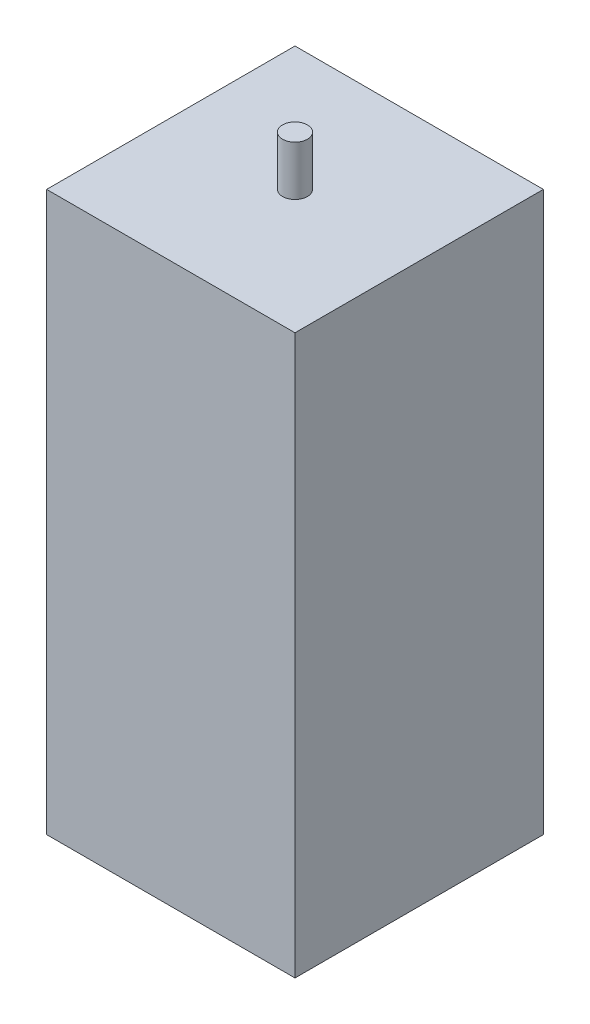
ISO-10303-21;
HEADER;
FILE_DESCRIPTION(('STEP AP214'),'2;1');
FILE_NAME('part.step','',(''),(''),'','','');
FILE_SCHEMA(('AUTOMOTIVE_DESIGN { 1 0 10303 214 1 1 1 1 }'));
ENDSEC;
DATA;
#1=APPLICATION_CONTEXT('core data for automotive mechanical design processes');
#2=APPLICATION_PROTOCOL_DEFINITION('international standard','automotive_design',2000,#1);
#3=PRODUCT_CONTEXT('',#1,'mechanical');
#4=PRODUCT('Part','Part','',(#3));
#5=PRODUCT_RELATED_PRODUCT_CATEGORY('part','',(#4));
#6=PRODUCT_DEFINITION_FORMATION('','',#4);
#7=PRODUCT_DEFINITION_CONTEXT('part definition',#1,'design');
#8=PRODUCT_DEFINITION('design','',#6,#7);
#9=PRODUCT_DEFINITION_SHAPE('','',#8);
#10=(LENGTH_UNIT() NAMED_UNIT(*) SI_UNIT(.MILLI.,.METRE.));
#11=(NAMED_UNIT(*) PLANE_ANGLE_UNIT() SI_UNIT($,.RADIAN.));
#12=(NAMED_UNIT(*) SI_UNIT($,.STERADIAN.) SOLID_ANGLE_UNIT());
#13=UNCERTAINTY_MEASURE_WITH_UNIT(LENGTH_MEASURE(1.E-05),#10,'distance_accuracy_value','');
#14=(GEOMETRIC_REPRESENTATION_CONTEXT(3) GLOBAL_UNCERTAINTY_ASSIGNED_CONTEXT((#13)) GLOBAL_UNIT_ASSIGNED_CONTEXT((#10,
#11,#12)) REPRESENTATION_CONTEXT('',''));
#15=CARTESIAN_POINT('',(0.,0.,0.));
#16=DIRECTION('',(0.,0.,1.));
#17=DIRECTION('',(1.,0.,0.));
#18=AXIS2_PLACEMENT_3D('',#15,#16,#17);
#19=CARTESIAN_POINT('',(-5.00000000000001,11.25,10.));
#20=DIRECTION('',(1.,0.,0.));
#21=DIRECTION('',(0.,1.,0.));
#22=AXIS2_PLACEMENT_3D('',#19,#20,#21);
#23=PLANE('',#22);
#24=DIRECTION('',(0.,-1.,0.));
#25=VECTOR('',#24,1.);
#26=CARTESIAN_POINT('',(-5.00000000000001,11.25,0.));
#27=LINE('',#26,#25);
#28=CARTESIAN_POINT('',(-5.00000000000001,11.25,0.));
#29=VERTEX_POINT('',#28);
#30=CARTESIAN_POINT('',(-5.,-11.25,0.));
#31=VERTEX_POINT('',#30);
#32=EDGE_CURVE('E97',#29,#31,#27,.T.);
#33=ORIENTED_EDGE('',*,*,#32,.T.);
#34=DIRECTION('',(0.,0.,-1.));
#35=VECTOR('',#34,1.);
#36=CARTESIAN_POINT('',(-5.,-11.25,10.));
#37=LINE('',#36,#35);
#38=CARTESIAN_POINT('',(-5.,-11.25,10.));
#39=VERTEX_POINT('',#38);
#40=EDGE_CURVE('E11',#39,#31,#37,.T.);
#41=ORIENTED_EDGE('',*,*,#40,.F.);
#42=DIRECTION('',(0.,-1.,0.));
#43=VECTOR('',#42,1.);
#44=CARTESIAN_POINT('',(-5.00000000000001,11.25,10.));
#45=LINE('',#44,#43);
#46=CARTESIAN_POINT('',(-5.00000000000001,11.25,10.));
#47=VERTEX_POINT('',#46);
#48=EDGE_CURVE('E84',#47,#39,#45,.T.);
#49=ORIENTED_EDGE('',*,*,#48,.F.);
#50=DIRECTION('',(0.,0.,-1.));
#51=VECTOR('',#50,1.);
#52=CARTESIAN_POINT('',(-5.00000000000001,11.25,10.));
#53=LINE('',#52,#51);
#54=EDGE_CURVE('E93',#47,#29,#53,.T.);
#55=ORIENTED_EDGE('',*,*,#54,.T.);
#56=EDGE_LOOP('',(#33,#41,#49,#55));
#57=FACE_BOUND('',#56,.T.);
#58=ADVANCED_FACE('F32',(#57),#23,.F.);
#59=CARTESIAN_POINT('',(-5.,-11.25,10.));
#60=DIRECTION('',(0.,1.,0.));
#61=DIRECTION('',(0.,0.,1.));
#62=AXIS2_PLACEMENT_3D('',#59,#60,#61);
#63=PLANE('',#62);
#64=CARTESIAN_POINT('',(0.,-11.25,5.));
#65=DIRECTION('',(0.,1.,0.));
#66=DIRECTION('',(0.,0.,1.));
#67=AXIS2_PLACEMENT_3D('',#64,#65,#66);
#68=CIRCLE('',#67,0.500000000000001);
#69=CARTESIAN_POINT('',(0.,-11.25,5.5));
#70=VERTEX_POINT('',#69);
#71=EDGE_CURVE('E100',#70,#70,#68,.T.);
#72=ORIENTED_EDGE('',*,*,#71,.T.);
#73=EDGE_LOOP('',(#72));
#74=FACE_BOUND('',#73,.T.);
#75=DIRECTION('',(1.,0.,0.));
#76=VECTOR('',#75,1.);
#77=CARTESIAN_POINT('',(-5.,-11.25,0.));
#78=LINE('',#77,#76);
#79=CARTESIAN_POINT('',(5.,-11.25,0.));
#80=VERTEX_POINT('',#79);
#81=EDGE_CURVE('E88',#31,#80,#78,.T.);
#82=ORIENTED_EDGE('',*,*,#81,.T.);
#83=DIRECTION('',(0.,0.,-1.));
#84=VECTOR('',#83,1.);
#85=CARTESIAN_POINT('',(5.,-11.25,10.));
#86=LINE('',#85,#84);
#87=CARTESIAN_POINT('',(5.,-11.25,10.));
#88=VERTEX_POINT('',#87);
#89=EDGE_CURVE('E41',#88,#80,#86,.T.);
#90=ORIENTED_EDGE('',*,*,#89,.F.);
#91=DIRECTION('',(1.,0.,0.));
#92=VECTOR('',#91,1.);
#93=CARTESIAN_POINT('',(-5.,-11.25,10.));
#94=LINE('',#93,#92);
#95=EDGE_CURVE('E79',#39,#88,#94,.T.);
#96=ORIENTED_EDGE('',*,*,#95,.F.);
#97=ORIENTED_EDGE('',*,*,#40,.T.);
#98=EDGE_LOOP('',(#82,#90,#96,#97));
#99=FACE_BOUND('',#98,.T.);
#100=ADVANCED_FACE('F87',(#74,#99),#63,.F.);
#101=CARTESIAN_POINT('',(5.00000000000002,11.25,10.));
#102=DIRECTION('',(-1.,0.,0.));
#103=DIRECTION('',(0.,-1.,0.));
#104=AXIS2_PLACEMENT_3D('',#101,#102,#103);
#105=PLANE('',#104);
#106=DIRECTION('',(0.,1.,0.));
#107=VECTOR('',#106,1.);
#108=CARTESIAN_POINT('',(5.00000000000002,11.25,0.));
#109=LINE('',#108,#107);
#110=CARTESIAN_POINT('',(5.00000000000002,11.25,0.));
#111=VERTEX_POINT('',#110);
#112=EDGE_CURVE('E66',#80,#111,#109,.T.);
#113=ORIENTED_EDGE('',*,*,#112,.T.);
#114=DIRECTION('',(0.,0.,-1.));
#115=VECTOR('',#114,1.);
#116=CARTESIAN_POINT('',(5.00000000000002,11.25,10.));
#117=LINE('',#116,#115);
#118=CARTESIAN_POINT('',(5.00000000000002,11.25,10.));
#119=VERTEX_POINT('',#118);
#120=EDGE_CURVE('E89',#119,#111,#117,.T.);
#121=ORIENTED_EDGE('',*,*,#120,.F.);
#122=DIRECTION('',(0.,1.,0.));
#123=VECTOR('',#122,1.);
#124=CARTESIAN_POINT('',(5.00000000000002,11.25,10.));
#125=LINE('',#124,#123);
#126=EDGE_CURVE('E82',#88,#119,#125,.T.);
#127=ORIENTED_EDGE('',*,*,#126,.F.);
#128=ORIENTED_EDGE('',*,*,#89,.T.);
#129=EDGE_LOOP('',(#113,#121,#127,#128));
#130=FACE_BOUND('',#129,.T.);
#131=ADVANCED_FACE('F91',(#130),#105,.F.);
#132=CARTESIAN_POINT('',(-5.00000000000001,11.25,10.));
#133=DIRECTION('',(0.,-1.,0.));
#134=DIRECTION('',(1.,0.,0.));
#135=AXIS2_PLACEMENT_3D('',#132,#133,#134);
#136=PLANE('',#135);
#137=CARTESIAN_POINT('',(0.,11.25,5.));
#138=DIRECTION('',(0.,-1.,0.));
#139=DIRECTION('',(1.,0.,0.));
#140=AXIS2_PLACEMENT_3D('',#137,#138,#139);
#141=CIRCLE('',#140,0.500000000000001);
#142=CARTESIAN_POINT('',(0.5,11.25,5.));
#143=VERTEX_POINT('',#142);
#144=EDGE_CURVE('E35',#143,#143,#141,.T.);
#145=ORIENTED_EDGE('',*,*,#144,.T.);
#146=EDGE_LOOP('',(#145));
#147=FACE_BOUND('',#146,.T.);
#148=DIRECTION('',(-1.,0.,0.));
#149=VECTOR('',#148,1.);
#150=CARTESIAN_POINT('',(-5.00000000000001,11.25,0.));
#151=LINE('',#150,#149);
#152=EDGE_CURVE('E72',#111,#29,#151,.T.);
#153=ORIENTED_EDGE('',*,*,#152,.T.);
#154=ORIENTED_EDGE('',*,*,#54,.F.);
#155=DIRECTION('',(-1.,0.,0.));
#156=VECTOR('',#155,1.);
#157=CARTESIAN_POINT('',(-5.00000000000001,11.25,10.));
#158=LINE('',#157,#156);
#159=EDGE_CURVE('E49',#119,#47,#158,.T.);
#160=ORIENTED_EDGE('',*,*,#159,.F.);
#161=ORIENTED_EDGE('',*,*,#120,.T.);
#162=EDGE_LOOP('',(#153,#154,#160,#161));
#163=FACE_BOUND('',#162,.T.);
#164=ADVANCED_FACE('F105',(#147,#163),#136,.F.);
#165=CARTESIAN_POINT('',(0.,0.,10.));
#166=DIRECTION('',(0.,0.,1.));
#167=DIRECTION('',(1.,0.,0.));
#168=AXIS2_PLACEMENT_3D('',#165,#166,#167);
#169=PLANE('',#168);
#170=ORIENTED_EDGE('',*,*,#48,.T.);
#171=ORIENTED_EDGE('',*,*,#95,.T.);
#172=ORIENTED_EDGE('',*,*,#126,.T.);
#173=ORIENTED_EDGE('',*,*,#159,.T.);
#174=EDGE_LOOP('',(#170,#171,#172,#173));
#175=FACE_BOUND('',#174,.T.);
#176=ADVANCED_FACE('F80',(#175),#169,.T.);
#177=CARTESIAN_POINT('',(0.,0.,0.));
#178=DIRECTION('',(0.,0.,1.));
#179=DIRECTION('',(1.,0.,0.));
#180=AXIS2_PLACEMENT_3D('',#177,#178,#179);
#181=PLANE('',#180);
#182=ORIENTED_EDGE('',*,*,#32,.F.);
#183=ORIENTED_EDGE('',*,*,#152,.F.);
#184=ORIENTED_EDGE('',*,*,#112,.F.);
#185=ORIENTED_EDGE('',*,*,#81,.F.);
#186=EDGE_LOOP('',(#182,#183,#184,#185));
#187=FACE_BOUND('',#186,.T.);
#188=ADVANCED_FACE('F108',(#187),#181,.F.);
#189=CARTESIAN_POINT('',(0.,13.25,5.));
#190=DIRECTION('',(0.,1.,0.));
#191=DIRECTION('',(0.,0.,1.));
#192=AXIS2_PLACEMENT_3D('',#189,#190,#191);
#193=PLANE('',#192);
#194=CARTESIAN_POINT('',(0.,13.25,5.));
#195=DIRECTION('',(0.,1.,0.));
#196=DIRECTION('',(0.,0.,1.));
#197=AXIS2_PLACEMENT_3D('',#194,#195,#196);
#198=CIRCLE('',#197,0.500000000000001);
#199=CARTESIAN_POINT('',(0.,13.25,5.5));
#200=VERTEX_POINT('',#199);
#201=EDGE_CURVE('E116',#200,#200,#198,.T.);
#202=ORIENTED_EDGE('',*,*,#201,.T.);
#203=EDGE_LOOP('',(#202));
#204=FACE_BOUND('',#203,.T.);
#205=ADVANCED_FACE('F120',(#204),#193,.T.);
#206=CARTESIAN_POINT('',(0.,-13.25,5.));
#207=DIRECTION('',(0.,1.,0.));
#208=DIRECTION('',(0.,0.,1.));
#209=AXIS2_PLACEMENT_3D('',#206,#207,#208);
#210=CYLINDRICAL_SURFACE('',#209,0.500000000000001);
#211=ORIENTED_EDGE('',*,*,#201,.F.);
#212=EDGE_LOOP('',(#211));
#213=FACE_BOUND('',#212,.T.);
#214=ORIENTED_EDGE('',*,*,#144,.F.);
#215=EDGE_LOOP('',(#214));
#216=FACE_BOUND('',#215,.T.);
#217=ADVANCED_FACE('F122',(#213,#216),#210,.T.);
#218=CARTESIAN_POINT('',(0.,-13.25,5.));
#219=DIRECTION('',(0.,1.,0.));
#220=DIRECTION('',(0.,0.,1.));
#221=AXIS2_PLACEMENT_3D('',#218,#219,#220);
#222=CIRCLE('',#221,0.500000000000001);
#223=CARTESIAN_POINT('',(0.,-13.25,5.5));
#224=VERTEX_POINT('',#223);
#225=EDGE_CURVE('E113',#224,#224,#222,.T.);
#226=ORIENTED_EDGE('',*,*,#225,.T.);
#227=EDGE_LOOP('',(#226));
#228=FACE_BOUND('',#227,.T.);
#229=ORIENTED_EDGE('',*,*,#71,.F.);
#230=EDGE_LOOP('',(#229));
#231=FACE_BOUND('',#230,.T.);
#232=ADVANCED_FACE('F125',(#228,#231),#210,.T.);
#233=CARTESIAN_POINT('',(0.,-13.25,5.));
#234=DIRECTION('',(0.,1.,0.));
#235=DIRECTION('',(0.,0.,1.));
#236=AXIS2_PLACEMENT_3D('',#233,#234,#235);
#237=PLANE('',#236);
#238=ORIENTED_EDGE('',*,*,#225,.F.);
#239=EDGE_LOOP('',(#238));
#240=FACE_BOUND('',#239,.T.);
#241=ADVANCED_FACE('F149',(#240),#237,.F.);
#242=CLOSED_SHELL('',(#58,#100,#131,#164,#176,#188,#205,#217,#232,#241));
#243=MANIFOLD_SOLID_BREP('B2',#242);
#244=ADVANCED_BREP_SHAPE_REPRESENTATION('',(#18,#243),#14);
#245=SHAPE_DEFINITION_REPRESENTATION(#9,#244);
ENDSEC;
END-ISO-10303-21;
